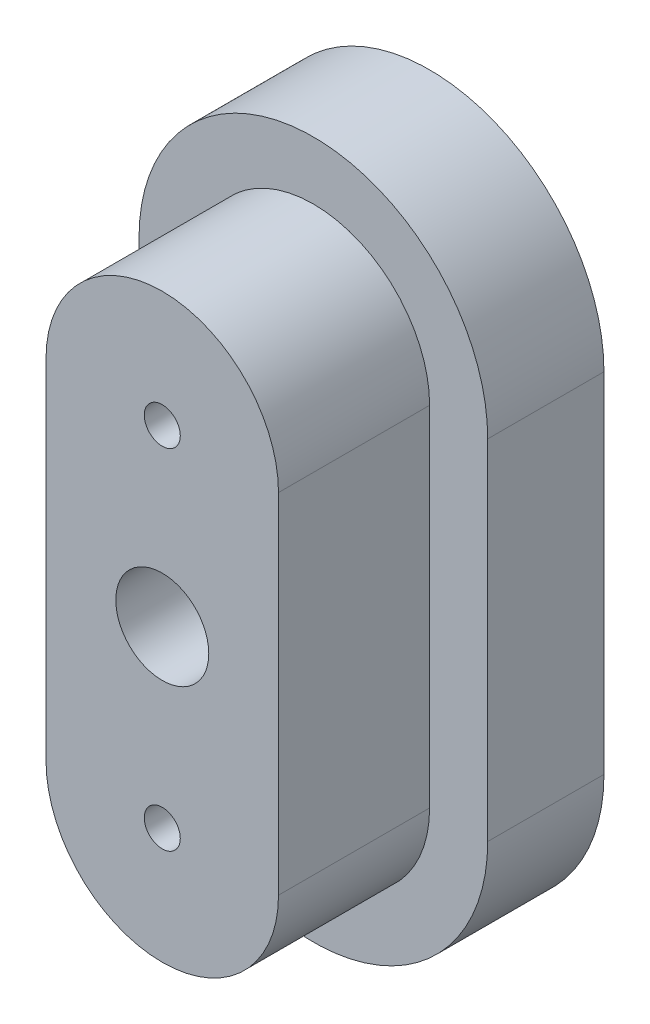
ISO-10303-21;
HEADER;
FILE_DESCRIPTION(('STEP AP214'),'2;1');
FILE_NAME('part.step','',(''),(''),'','','');
FILE_SCHEMA(('AUTOMOTIVE_DESIGN { 1 0 10303 214 1 1 1 1 }'));
ENDSEC;
DATA;
#1=APPLICATION_CONTEXT('core data for automotive mechanical design processes');
#2=APPLICATION_PROTOCOL_DEFINITION('international standard','automotive_design',2000,#1);
#3=PRODUCT_CONTEXT('',#1,'mechanical');
#4=PRODUCT('Part','Part','',(#3));
#5=PRODUCT_RELATED_PRODUCT_CATEGORY('part','',(#4));
#6=PRODUCT_DEFINITION_FORMATION('','',#4);
#7=PRODUCT_DEFINITION_CONTEXT('part definition',#1,'design');
#8=PRODUCT_DEFINITION('design','',#6,#7);
#9=PRODUCT_DEFINITION_SHAPE('','',#8);
#10=(LENGTH_UNIT() NAMED_UNIT(*) SI_UNIT(.MILLI.,.METRE.));
#11=(NAMED_UNIT(*) PLANE_ANGLE_UNIT() SI_UNIT($,.RADIAN.));
#12=(NAMED_UNIT(*) SI_UNIT($,.STERADIAN.) SOLID_ANGLE_UNIT());
#13=UNCERTAINTY_MEASURE_WITH_UNIT(LENGTH_MEASURE(1.E-05),#10,'distance_accuracy_value','');
#14=(GEOMETRIC_REPRESENTATION_CONTEXT(3) GLOBAL_UNCERTAINTY_ASSIGNED_CONTEXT((#13)) GLOBAL_UNIT_ASSIGNED_CONTEXT((#10,
#11,#12)) REPRESENTATION_CONTEXT('',''));
#15=CARTESIAN_POINT('',(0.,0.,0.));
#16=DIRECTION('',(0.,0.,1.));
#17=DIRECTION('',(1.,0.,0.));
#18=AXIS2_PLACEMENT_3D('',#15,#16,#17);
#19=CARTESIAN_POINT('',(0.,-4.78633147903446,-7.));
#20=DIRECTION('',(0.,0.,1.));
#21=DIRECTION('',(1.,0.,0.));
#22=AXIS2_PLACEMENT_3D('',#19,#20,#21);
#23=CYLINDRICAL_SURFACE('',#22,1.55);
#24=CARTESIAN_POINT('',(0.,-4.78633147903446,23.));
#25=DIRECTION('',(0.,0.,1.));
#26=DIRECTION('',(1.,0.,0.));
#27=AXIS2_PLACEMENT_3D('',#24,#25,#26);
#28=CIRCLE('',#27,1.55);
#29=CARTESIAN_POINT('',(1.55,-4.78633147903446,23.));
#30=VERTEX_POINT('',#29);
#31=EDGE_CURVE('E158',#30,#30,#28,.T.);
#32=ORIENTED_EDGE('',*,*,#31,.T.);
#33=EDGE_LOOP('',(#32));
#34=FACE_BOUND('',#33,.T.);
#35=CARTESIAN_POINT('',(0.,-4.78633147903446,3.));
#36=DIRECTION('',(0.,0.,-1.));
#37=DIRECTION('',(-1.,0.,0.));
#38=AXIS2_PLACEMENT_3D('',#35,#36,#37);
#39=CIRCLE('',#38,1.55);
#40=CARTESIAN_POINT('',(-1.55,-4.78633147903446,3.));
#41=VERTEX_POINT('',#40);
#42=EDGE_CURVE('E43',#41,#41,#39,.F.);
#43=ORIENTED_EDGE('',*,*,#42,.F.);
#44=EDGE_LOOP('',(#43));
#45=FACE_BOUND('',#44,.T.);
#46=ADVANCED_FACE('F39',(#34,#45),#23,.F.);
#47=CARTESIAN_POINT('',(0.,25.2136685209655,-7.));
#48=DIRECTION('',(0.,0.,1.));
#49=DIRECTION('',(1.,0.,0.));
#50=AXIS2_PLACEMENT_3D('',#47,#48,#49);
#51=CYLINDRICAL_SURFACE('',#50,1.55);
#52=CARTESIAN_POINT('',(0.,25.2136685209655,23.));
#53=DIRECTION('',(0.,0.,1.));
#54=DIRECTION('',(1.,0.,0.));
#55=AXIS2_PLACEMENT_3D('',#52,#53,#54);
#56=CIRCLE('',#55,1.55);
#57=CARTESIAN_POINT('',(1.55,25.2136685209655,23.));
#58=VERTEX_POINT('',#57);
#59=EDGE_CURVE('E164',#58,#58,#56,.T.);
#60=ORIENTED_EDGE('',*,*,#59,.T.);
#61=EDGE_LOOP('',(#60));
#62=FACE_BOUND('',#61,.T.);
#63=CARTESIAN_POINT('',(0.,25.2136685209655,3.));
#64=DIRECTION('',(0.,0.,-1.));
#65=DIRECTION('',(-1.,0.,0.));
#66=AXIS2_PLACEMENT_3D('',#63,#64,#65);
#67=CIRCLE('',#66,1.55);
#68=CARTESIAN_POINT('',(-1.55,25.2136685209655,3.));
#69=VERTEX_POINT('',#68);
#70=EDGE_CURVE('E181',#69,#69,#67,.F.);
#71=ORIENTED_EDGE('',*,*,#70,.F.);
#72=EDGE_LOOP('',(#71));
#73=FACE_BOUND('',#72,.T.);
#74=ADVANCED_FACE('F224',(#62,#73),#51,.F.);
#75=CARTESIAN_POINT('',(0.,-4.78633147903445,23.));
#76=DIRECTION('',(0.,0.,-1.));
#77=DIRECTION('',(-1.,0.,0.));
#78=AXIS2_PLACEMENT_3D('',#75,#76,#77);
#79=CYLINDRICAL_SURFACE('',#78,10.);
#80=CARTESIAN_POINT('',(0.,-4.78633147903444,10.));
#81=DIRECTION('',(0.,0.,-1.));
#82=DIRECTION('',(1.,0.,0.));
#83=AXIS2_PLACEMENT_3D('',#80,#81,#82);
#84=CIRCLE('',#83,10.);
#85=CARTESIAN_POINT('',(10.,-4.78633147903445,10.));
#86=VERTEX_POINT('',#85);
#87=CARTESIAN_POINT('',(-10.,-4.78633147903445,10.));
#88=VERTEX_POINT('',#87);
#89=EDGE_CURVE('E56',#86,#88,#84,.T.);
#90=ORIENTED_EDGE('',*,*,#89,.F.);
#91=DIRECTION('',(0.,0.,-1.));
#92=VECTOR('',#91,1.);
#93=CARTESIAN_POINT('',(10.,-4.78633147903445,23.));
#94=LINE('',#93,#92);
#95=CARTESIAN_POINT('',(10.,-4.78633147903445,23.));
#96=VERTEX_POINT('',#95);
#97=EDGE_CURVE('E11',#96,#86,#94,.T.);
#98=ORIENTED_EDGE('',*,*,#97,.F.);
#99=CARTESIAN_POINT('',(0.,-4.78633147903445,23.));
#100=DIRECTION('',(0.,0.,1.));
#101=DIRECTION('',(1.,0.,0.));
#102=AXIS2_PLACEMENT_3D('',#99,#100,#101);
#103=CIRCLE('',#102,10.);
#104=CARTESIAN_POINT('',(-10.,-4.78633147903445,23.));
#105=VERTEX_POINT('',#104);
#106=EDGE_CURVE('E167',#105,#96,#103,.T.);
#107=ORIENTED_EDGE('',*,*,#106,.F.);
#108=DIRECTION('',(0.,0.,-1.));
#109=VECTOR('',#108,1.);
#110=CARTESIAN_POINT('',(-10.,-4.78633147903445,23.));
#111=LINE('',#110,#109);
#112=EDGE_CURVE('E117',#105,#88,#111,.T.);
#113=ORIENTED_EDGE('',*,*,#112,.T.);
#114=EDGE_LOOP('',(#90,#98,#107,#113));
#115=FACE_BOUND('',#114,.T.);
#116=ADVANCED_FACE('F41',(#115),#79,.T.);
#117=CARTESIAN_POINT('',(10.,-4.78633147903445,23.));
#118=DIRECTION('',(-1.,0.,0.));
#119=DIRECTION('',(0.,-1.,0.));
#120=AXIS2_PLACEMENT_3D('',#117,#118,#119);
#121=PLANE('',#120);
#122=DIRECTION('',(0.,-1.,0.));
#123=VECTOR('',#122,1.);
#124=CARTESIAN_POINT('',(10.,25.2136685209655,10.));
#125=LINE('',#124,#123);
#126=CARTESIAN_POINT('',(10.,25.2136685209655,10.));
#127=VERTEX_POINT('',#126);
#128=EDGE_CURVE('E62',#127,#86,#125,.T.);
#129=ORIENTED_EDGE('',*,*,#128,.F.);
#130=DIRECTION('',(0.,0.,-1.));
#131=VECTOR('',#130,1.);
#132=CARTESIAN_POINT('',(10.,25.2136685209655,23.));
#133=LINE('',#132,#131);
#134=CARTESIAN_POINT('',(10.,25.2136685209655,23.));
#135=VERTEX_POINT('',#134);
#136=EDGE_CURVE('E48',#135,#127,#133,.T.);
#137=ORIENTED_EDGE('',*,*,#136,.F.);
#138=DIRECTION('',(0.,1.,0.));
#139=VECTOR('',#138,1.);
#140=CARTESIAN_POINT('',(10.,-4.78633147903445,23.));
#141=LINE('',#140,#139);
#142=EDGE_CURVE('E172',#96,#135,#141,.T.);
#143=ORIENTED_EDGE('',*,*,#142,.F.);
#144=ORIENTED_EDGE('',*,*,#97,.T.);
#145=EDGE_LOOP('',(#129,#137,#143,#144));
#146=FACE_BOUND('',#145,.T.);
#147=ADVANCED_FACE('F217',(#146),#121,.F.);
#148=CARTESIAN_POINT('',(0.,25.2136685209655,23.));
#149=DIRECTION('',(0.,0.,-1.));
#150=DIRECTION('',(-1.,0.,0.));
#151=AXIS2_PLACEMENT_3D('',#148,#149,#150);
#152=CYLINDRICAL_SURFACE('',#151,10.);
#153=CARTESIAN_POINT('',(0.,25.2136685209655,10.));
#154=DIRECTION('',(0.,0.,-1.));
#155=DIRECTION('',(1.,0.,0.));
#156=AXIS2_PLACEMENT_3D('',#153,#154,#155);
#157=CIRCLE('',#156,10.);
#158=CARTESIAN_POINT('',(-10.,25.2136685209656,10.));
#159=VERTEX_POINT('',#158);
#160=EDGE_CURVE('E120',#159,#127,#157,.T.);
#161=ORIENTED_EDGE('',*,*,#160,.F.);
#162=DIRECTION('',(0.,0.,-1.));
#163=VECTOR('',#162,1.);
#164=CARTESIAN_POINT('',(-10.,25.2136685209655,23.));
#165=LINE('',#164,#163);
#166=CARTESIAN_POINT('',(-10.,25.2136685209655,23.));
#167=VERTEX_POINT('',#166);
#168=EDGE_CURVE('E108',#167,#159,#165,.T.);
#169=ORIENTED_EDGE('',*,*,#168,.F.);
#170=CARTESIAN_POINT('',(0.,25.2136685209655,23.));
#171=DIRECTION('',(0.,0.,1.));
#172=DIRECTION('',(1.,0.,0.));
#173=AXIS2_PLACEMENT_3D('',#170,#171,#172);
#174=CIRCLE('',#173,10.);
#175=EDGE_CURVE('E174',#135,#167,#174,.T.);
#176=ORIENTED_EDGE('',*,*,#175,.F.);
#177=ORIENTED_EDGE('',*,*,#136,.T.);
#178=EDGE_LOOP('',(#161,#169,#176,#177));
#179=FACE_BOUND('',#178,.T.);
#180=ADVANCED_FACE('F121',(#179),#152,.T.);
#181=CARTESIAN_POINT('',(-10.,-4.78633147903445,23.));
#182=DIRECTION('',(1.,0.,0.));
#183=DIRECTION('',(0.,1.,0.));
#184=AXIS2_PLACEMENT_3D('',#181,#182,#183);
#185=PLANE('',#184);
#186=DIRECTION('',(0.,1.,0.));
#187=VECTOR('',#186,1.);
#188=CARTESIAN_POINT('',(-10.,25.2136685209656,10.));
#189=LINE('',#188,#187);
#190=EDGE_CURVE('E113',#88,#159,#189,.T.);
#191=ORIENTED_EDGE('',*,*,#190,.F.);
#192=ORIENTED_EDGE('',*,*,#112,.F.);
#193=DIRECTION('',(0.,-1.,0.));
#194=VECTOR('',#193,1.);
#195=CARTESIAN_POINT('',(-10.,-4.78633147903445,23.));
#196=LINE('',#195,#194);
#197=EDGE_CURVE('E114',#167,#105,#196,.T.);
#198=ORIENTED_EDGE('',*,*,#197,.F.);
#199=ORIENTED_EDGE('',*,*,#168,.T.);
#200=EDGE_LOOP('',(#191,#192,#198,#199));
#201=FACE_BOUND('',#200,.T.);
#202=ADVANCED_FACE('F110',(#201),#185,.F.);
#203=CARTESIAN_POINT('',(0.,-4.78633147903445,23.));
#204=DIRECTION('',(0.,0.,1.));
#205=DIRECTION('',(1.,0.,0.));
#206=AXIS2_PLACEMENT_3D('',#203,#204,#205);
#207=PLANE('',#206);
#208=CARTESIAN_POINT('',(0.,10.2136685209655,23.));
#209=DIRECTION('',(0.,0.,1.));
#210=DIRECTION('',(1.,0.,0.));
#211=AXIS2_PLACEMENT_3D('',#208,#209,#210);
#212=CIRCLE('',#211,4.);
#213=CARTESIAN_POINT('',(4.,10.2136685209655,23.));
#214=VERTEX_POINT('',#213);
#215=EDGE_CURVE('E180',#214,#214,#212,.T.);
#216=ORIENTED_EDGE('',*,*,#215,.F.);
#217=EDGE_LOOP('',(#216));
#218=FACE_BOUND('',#217,.T.);
#219=ORIENTED_EDGE('',*,*,#59,.F.);
#220=EDGE_LOOP('',(#219));
#221=FACE_BOUND('',#220,.T.);
#222=ORIENTED_EDGE('',*,*,#31,.F.);
#223=EDGE_LOOP('',(#222));
#224=FACE_BOUND('',#223,.T.);
#225=ORIENTED_EDGE('',*,*,#106,.T.);
#226=ORIENTED_EDGE('',*,*,#142,.T.);
#227=ORIENTED_EDGE('',*,*,#175,.T.);
#228=ORIENTED_EDGE('',*,*,#197,.T.);
#229=EDGE_LOOP('',(#225,#226,#227,#228));
#230=FACE_BOUND('',#229,.T.);
#231=ADVANCED_FACE('F207',(#218,#221,#224,#230),#207,.T.);
#232=CARTESIAN_POINT('',(0.,-4.78633147903445,0.));
#233=DIRECTION('',(0.,0.,1.));
#234=DIRECTION('',(1.,0.,0.));
#235=AXIS2_PLACEMENT_3D('',#232,#233,#234);
#236=PLANE('',#235);
#237=CARTESIAN_POINT('',(0.,25.2136685209655,0.));
#238=DIRECTION('',(0.,0.,-1.));
#239=DIRECTION('',(-1.,0.,0.));
#240=AXIS2_PLACEMENT_3D('',#237,#238,#239);
#241=CIRCLE('',#240,4.15);
#242=CARTESIAN_POINT('',(-4.15,25.2136685209655,0.));
#243=VERTEX_POINT('',#242);
#244=EDGE_CURVE('E188',#243,#243,#241,.T.);
#245=ORIENTED_EDGE('',*,*,#244,.F.);
#246=EDGE_LOOP('',(#245));
#247=FACE_BOUND('',#246,.T.);
#248=CARTESIAN_POINT('',(0.,-4.78633147903446,0.));
#249=DIRECTION('',(0.,0.,-1.));
#250=DIRECTION('',(-1.,0.,0.));
#251=AXIS2_PLACEMENT_3D('',#248,#249,#250);
#252=CIRCLE('',#251,4.15);
#253=CARTESIAN_POINT('',(-4.15,-4.78633147903446,0.));
#254=VERTEX_POINT('',#253);
#255=EDGE_CURVE('E193',#254,#254,#252,.T.);
#256=ORIENTED_EDGE('',*,*,#255,.F.);
#257=EDGE_LOOP('',(#256));
#258=FACE_BOUND('',#257,.T.);
#259=CARTESIAN_POINT('',(0.,10.2136685209655,0.));
#260=DIRECTION('',(0.,0.,1.));
#261=DIRECTION('',(1.,0.,0.));
#262=AXIS2_PLACEMENT_3D('',#259,#260,#261);
#263=CIRCLE('',#262,4.);
#264=CARTESIAN_POINT('',(4.,10.2136685209655,0.));
#265=VERTEX_POINT('',#264);
#266=EDGE_CURVE('E123',#265,#265,#263,.T.);
#267=ORIENTED_EDGE('',*,*,#266,.T.);
#268=EDGE_LOOP('',(#267));
#269=FACE_BOUND('',#268,.T.);
#270=CARTESIAN_POINT('',(0.,25.2136685209655,0.));
#271=DIRECTION('',(0.,0.,-1.));
#272=DIRECTION('',(-1.,0.,0.));
#273=AXIS2_PLACEMENT_3D('',#270,#271,#272);
#274=CIRCLE('',#273,15.);
#275=CARTESIAN_POINT('',(-15.,25.2136685209656,0.));
#276=VERTEX_POINT('',#275);
#277=CARTESIAN_POINT('',(15.,25.2136685209655,0.));
#278=VERTEX_POINT('',#277);
#279=EDGE_CURVE('E127',#276,#278,#274,.T.);
#280=ORIENTED_EDGE('',*,*,#279,.T.);
#281=DIRECTION('',(0.,-1.,0.));
#282=VECTOR('',#281,1.);
#283=CARTESIAN_POINT('',(15.,25.2136685209655,0.));
#284=LINE('',#283,#282);
#285=CARTESIAN_POINT('',(15.,-4.78633147903445,0.));
#286=VERTEX_POINT('',#285);
#287=EDGE_CURVE('E130',#278,#286,#284,.T.);
#288=ORIENTED_EDGE('',*,*,#287,.T.);
#289=CARTESIAN_POINT('',(0.,-4.78633147903444,0.));
#290=DIRECTION('',(0.,0.,-1.));
#291=DIRECTION('',(-1.,0.,0.));
#292=AXIS2_PLACEMENT_3D('',#289,#290,#291);
#293=CIRCLE('',#292,15.);
#294=CARTESIAN_POINT('',(-15.,-4.78633147903444,0.));
#295=VERTEX_POINT('',#294);
#296=EDGE_CURVE('E151',#286,#295,#293,.T.);
#297=ORIENTED_EDGE('',*,*,#296,.T.);
#298=DIRECTION('',(0.,1.,0.));
#299=VECTOR('',#298,1.);
#300=CARTESIAN_POINT('',(-15.,25.2136685209656,0.));
#301=LINE('',#300,#299);
#302=EDGE_CURVE('E139',#295,#276,#301,.T.);
#303=ORIENTED_EDGE('',*,*,#302,.T.);
#304=EDGE_LOOP('',(#280,#288,#297,#303));
#305=FACE_BOUND('',#304,.T.);
#306=ADVANCED_FACE('F210',(#247,#258,#269,#305),#236,.F.);
#307=CARTESIAN_POINT('',(0.,25.2136685209655,10.));
#308=DIRECTION('',(0.,0.,-1.));
#309=DIRECTION('',(-1.,0.,0.));
#310=AXIS2_PLACEMENT_3D('',#307,#308,#309);
#311=CYLINDRICAL_SURFACE('',#310,15.);
#312=ORIENTED_EDGE('',*,*,#279,.F.);
#313=DIRECTION('',(0.,0.,-1.));
#314=VECTOR('',#313,1.);
#315=CARTESIAN_POINT('',(-15.,25.2136685209656,10.));
#316=LINE('',#315,#314);
#317=CARTESIAN_POINT('',(-15.,25.2136685209656,10.));
#318=VERTEX_POINT('',#317);
#319=EDGE_CURVE('E156',#318,#276,#316,.T.);
#320=ORIENTED_EDGE('',*,*,#319,.F.);
#321=CARTESIAN_POINT('',(0.,25.2136685209655,10.));
#322=DIRECTION('',(0.,0.,-1.));
#323=DIRECTION('',(-1.,0.,0.));
#324=AXIS2_PLACEMENT_3D('',#321,#322,#323);
#325=CIRCLE('',#324,15.);
#326=CARTESIAN_POINT('',(15.,25.2136685209655,10.));
#327=VERTEX_POINT('',#326);
#328=EDGE_CURVE('E135',#318,#327,#325,.T.);
#329=ORIENTED_EDGE('',*,*,#328,.T.);
#330=DIRECTION('',(0.,0.,-1.));
#331=VECTOR('',#330,1.);
#332=CARTESIAN_POINT('',(15.,25.2136685209655,10.));
#333=LINE('',#332,#331);
#334=EDGE_CURVE('E147',#327,#278,#333,.T.);
#335=ORIENTED_EDGE('',*,*,#334,.T.);
#336=EDGE_LOOP('',(#312,#320,#329,#335));
#337=FACE_BOUND('',#336,.T.);
#338=ADVANCED_FACE('F238',(#337),#311,.T.);
#339=CARTESIAN_POINT('',(-15.,25.2136685209656,10.));
#340=DIRECTION('',(-1.,0.,0.));
#341=DIRECTION('',(0.,-1.,0.));
#342=AXIS2_PLACEMENT_3D('',#339,#340,#341);
#343=PLANE('',#342);
#344=ORIENTED_EDGE('',*,*,#302,.F.);
#345=DIRECTION('',(0.,0.,-1.));
#346=VECTOR('',#345,1.);
#347=CARTESIAN_POINT('',(-15.,-4.78633147903444,10.));
#348=LINE('',#347,#346);
#349=CARTESIAN_POINT('',(-15.,-4.78633147903444,10.));
#350=VERTEX_POINT('',#349);
#351=EDGE_CURVE('E159',#350,#295,#348,.T.);
#352=ORIENTED_EDGE('',*,*,#351,.F.);
#353=DIRECTION('',(0.,1.,0.));
#354=VECTOR('',#353,1.);
#355=CARTESIAN_POINT('',(-15.,25.2136685209656,10.));
#356=LINE('',#355,#354);
#357=EDGE_CURVE('E145',#350,#318,#356,.T.);
#358=ORIENTED_EDGE('',*,*,#357,.T.);
#359=ORIENTED_EDGE('',*,*,#319,.T.);
#360=EDGE_LOOP('',(#344,#352,#358,#359));
#361=FACE_BOUND('',#360,.T.);
#362=ADVANCED_FACE('F263',(#361),#343,.T.);
#363=CARTESIAN_POINT('',(0.,-4.78633147903444,10.));
#364=DIRECTION('',(0.,0.,-1.));
#365=DIRECTION('',(-1.,0.,0.));
#366=AXIS2_PLACEMENT_3D('',#363,#364,#365);
#367=CYLINDRICAL_SURFACE('',#366,15.);
#368=ORIENTED_EDGE('',*,*,#296,.F.);
#369=DIRECTION('',(0.,0.,-1.));
#370=VECTOR('',#369,1.);
#371=CARTESIAN_POINT('',(15.,-4.78633147903445,10.));
#372=LINE('',#371,#370);
#373=CARTESIAN_POINT('',(15.,-4.78633147903445,10.));
#374=VERTEX_POINT('',#373);
#375=EDGE_CURVE('E161',#374,#286,#372,.T.);
#376=ORIENTED_EDGE('',*,*,#375,.F.);
#377=CARTESIAN_POINT('',(0.,-4.78633147903444,10.));
#378=DIRECTION('',(0.,0.,-1.));
#379=DIRECTION('',(-1.,0.,0.));
#380=AXIS2_PLACEMENT_3D('',#377,#378,#379);
#381=CIRCLE('',#380,15.);
#382=EDGE_CURVE('E142',#374,#350,#381,.T.);
#383=ORIENTED_EDGE('',*,*,#382,.T.);
#384=ORIENTED_EDGE('',*,*,#351,.T.);
#385=EDGE_LOOP('',(#368,#376,#383,#384));
#386=FACE_BOUND('',#385,.T.);
#387=ADVANCED_FACE('F270',(#386),#367,.T.);
#388=CARTESIAN_POINT('',(15.,25.2136685209655,10.));
#389=DIRECTION('',(1.,0.,0.));
#390=DIRECTION('',(0.,0.,-1.));
#391=AXIS2_PLACEMENT_3D('',#388,#389,#390);
#392=PLANE('',#391);
#393=ORIENTED_EDGE('',*,*,#287,.F.);
#394=ORIENTED_EDGE('',*,*,#334,.F.);
#395=DIRECTION('',(0.,-1.,0.));
#396=VECTOR('',#395,1.);
#397=CARTESIAN_POINT('',(15.,25.2136685209655,10.));
#398=LINE('',#397,#396);
#399=EDGE_CURVE('E138',#327,#374,#398,.T.);
#400=ORIENTED_EDGE('',*,*,#399,.T.);
#401=ORIENTED_EDGE('',*,*,#375,.T.);
#402=EDGE_LOOP('',(#393,#394,#400,#401));
#403=FACE_BOUND('',#402,.T.);
#404=ADVANCED_FACE('F278',(#403),#392,.T.);
#405=CARTESIAN_POINT('',(0.,25.2136685209655,10.));
#406=DIRECTION('',(0.,0.,-1.));
#407=DIRECTION('',(-1.,0.,0.));
#408=AXIS2_PLACEMENT_3D('',#405,#406,#407);
#409=PLANE('',#408);
#410=ORIENTED_EDGE('',*,*,#190,.T.);
#411=ORIENTED_EDGE('',*,*,#160,.T.);
#412=ORIENTED_EDGE('',*,*,#128,.T.);
#413=ORIENTED_EDGE('',*,*,#89,.T.);
#414=EDGE_LOOP('',(#410,#411,#412,#413));
#415=FACE_BOUND('',#414,.T.);
#416=ORIENTED_EDGE('',*,*,#328,.F.);
#417=ORIENTED_EDGE('',*,*,#357,.F.);
#418=ORIENTED_EDGE('',*,*,#382,.F.);
#419=ORIENTED_EDGE('',*,*,#399,.F.);
#420=EDGE_LOOP('',(#416,#417,#418,#419));
#421=FACE_BOUND('',#420,.T.);
#422=ADVANCED_FACE('F125',(#415,#421),#409,.F.);
#423=CARTESIAN_POINT('',(0.,10.2136685209655,-47.));
#424=DIRECTION('',(0.,0.,1.));
#425=DIRECTION('',(1.,0.,0.));
#426=AXIS2_PLACEMENT_3D('',#423,#424,#425);
#427=CYLINDRICAL_SURFACE('',#426,4.);
#428=ORIENTED_EDGE('',*,*,#215,.T.);
#429=EDGE_LOOP('',(#428));
#430=FACE_BOUND('',#429,.T.);
#431=ORIENTED_EDGE('',*,*,#266,.F.);
#432=EDGE_LOOP('',(#431));
#433=FACE_BOUND('',#432,.T.);
#434=ADVANCED_FACE('F204',(#430,#433),#427,.F.);
#435=CARTESIAN_POINT('',(0.,25.2136685209655,3.));
#436=DIRECTION('',(0.,0.,-1.));
#437=DIRECTION('',(-1.,0.,0.));
#438=AXIS2_PLACEMENT_3D('',#435,#436,#437);
#439=PLANE('',#438);
#440=CARTESIAN_POINT('',(0.,25.2136685209655,3.));
#441=DIRECTION('',(0.,0.,-1.));
#442=DIRECTION('',(-1.,0.,0.));
#443=AXIS2_PLACEMENT_3D('',#440,#441,#442);
#444=CIRCLE('',#443,4.15);
#445=CARTESIAN_POINT('',(-4.15,25.2136685209655,3.));
#446=VERTEX_POINT('',#445);
#447=EDGE_CURVE('E183',#446,#446,#444,.T.);
#448=ORIENTED_EDGE('',*,*,#447,.T.);
#449=EDGE_LOOP('',(#448));
#450=FACE_BOUND('',#449,.T.);
#451=ORIENTED_EDGE('',*,*,#70,.T.);
#452=EDGE_LOOP('',(#451));
#453=FACE_BOUND('',#452,.T.);
#454=ADVANCED_FACE('F297',(#450,#453),#439,.T.);
#455=CARTESIAN_POINT('',(0.,25.2136685209655,3.));
#456=DIRECTION('',(0.,0.,-1.));
#457=DIRECTION('',(-1.,0.,0.));
#458=AXIS2_PLACEMENT_3D('',#455,#456,#457);
#459=CYLINDRICAL_SURFACE('',#458,4.15);
#460=ORIENTED_EDGE('',*,*,#447,.F.);
#461=EDGE_LOOP('',(#460));
#462=FACE_BOUND('',#461,.T.);
#463=ORIENTED_EDGE('',*,*,#244,.T.);
#464=EDGE_LOOP('',(#463));
#465=FACE_BOUND('',#464,.T.);
#466=ADVANCED_FACE('F303',(#462,#465),#459,.F.);
#467=CARTESIAN_POINT('',(0.,-4.78633147903446,3.));
#468=DIRECTION('',(0.,0.,-1.));
#469=DIRECTION('',(-1.,0.,0.));
#470=AXIS2_PLACEMENT_3D('',#467,#468,#469);
#471=PLANE('',#470);
#472=CARTESIAN_POINT('',(0.,-4.78633147903446,3.));
#473=DIRECTION('',(0.,0.,-1.));
#474=DIRECTION('',(-1.,0.,0.));
#475=AXIS2_PLACEMENT_3D('',#472,#473,#474);
#476=CIRCLE('',#475,4.15);
#477=CARTESIAN_POINT('',(-4.15,-4.78633147903446,3.));
#478=VERTEX_POINT('',#477);
#479=EDGE_CURVE('E198',#478,#478,#476,.T.);
#480=ORIENTED_EDGE('',*,*,#479,.T.);
#481=EDGE_LOOP('',(#480));
#482=FACE_BOUND('',#481,.T.);
#483=ORIENTED_EDGE('',*,*,#42,.T.);
#484=EDGE_LOOP('',(#483));
#485=FACE_BOUND('',#484,.T.);
#486=ADVANCED_FACE('F310',(#482,#485),#471,.T.);
#487=CARTESIAN_POINT('',(0.,-4.78633147903446,3.));
#488=DIRECTION('',(0.,0.,-1.));
#489=DIRECTION('',(-1.,0.,0.));
#490=AXIS2_PLACEMENT_3D('',#487,#488,#489);
#491=CYLINDRICAL_SURFACE('',#490,4.15);
#492=ORIENTED_EDGE('',*,*,#479,.F.);
#493=EDGE_LOOP('',(#492));
#494=FACE_BOUND('',#493,.T.);
#495=ORIENTED_EDGE('',*,*,#255,.T.);
#496=EDGE_LOOP('',(#495));
#497=FACE_BOUND('',#496,.T.);
#498=ADVANCED_FACE('F318',(#494,#497),#491,.F.);
#499=CLOSED_SHELL('',(#46,#74,#116,#147,#180,#202,#231,#306,#338,#362,#387,#404,#422,#434,#454,
#466,#486,#498));
#500=MANIFOLD_SOLID_BREP('B2',#499);
#501=ADVANCED_BREP_SHAPE_REPRESENTATION('',(#18,#500),#14);
#502=SHAPE_DEFINITION_REPRESENTATION(#9,#501);
ENDSEC;
END-ISO-10303-21;
